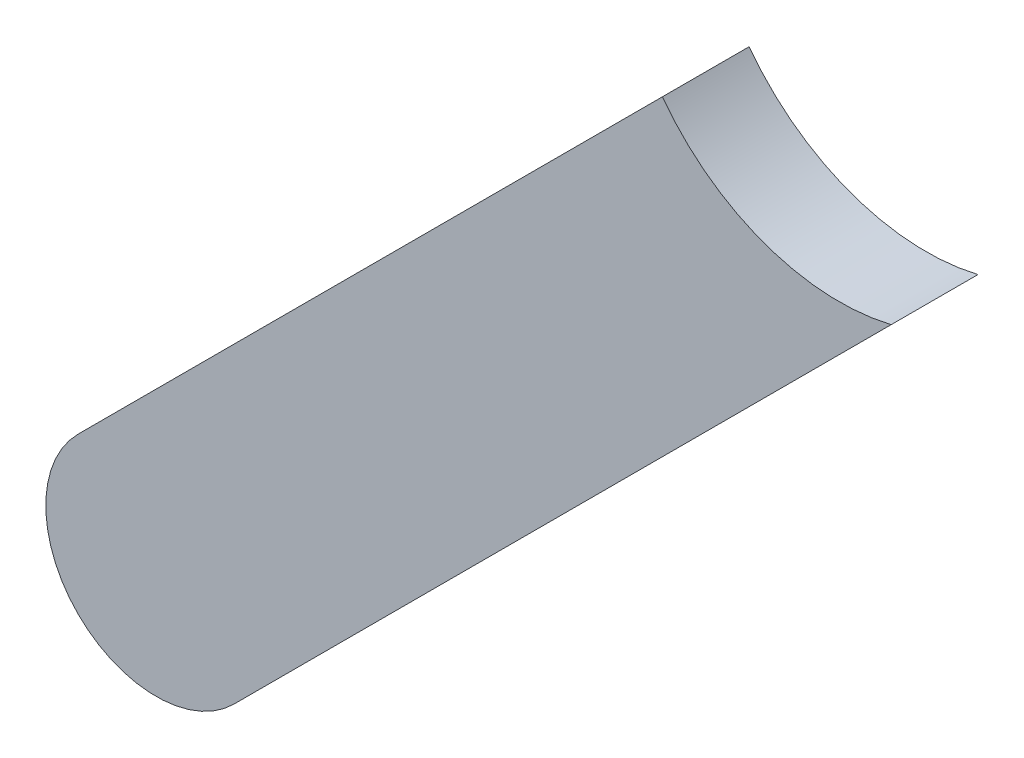
ISO-10303-21;
HEADER;
FILE_DESCRIPTION(('STEP AP214'),'2;1');
FILE_NAME('part.step','',(''),(''),'','','');
FILE_SCHEMA(('AUTOMOTIVE_DESIGN { 1 0 10303 214 1 1 1 1 }'));
ENDSEC;
DATA;
#1=APPLICATION_CONTEXT('core data for automotive mechanical design processes');
#2=APPLICATION_PROTOCOL_DEFINITION('international standard','automotive_design',2000,#1);
#3=PRODUCT_CONTEXT('',#1,'mechanical');
#4=PRODUCT('Part','Part','',(#3));
#5=PRODUCT_RELATED_PRODUCT_CATEGORY('part','',(#4));
#6=PRODUCT_DEFINITION_FORMATION('','',#4);
#7=PRODUCT_DEFINITION_CONTEXT('part definition',#1,'design');
#8=PRODUCT_DEFINITION('design','',#6,#7);
#9=PRODUCT_DEFINITION_SHAPE('','',#8);
#10=(LENGTH_UNIT() NAMED_UNIT(*) SI_UNIT(.MILLI.,.METRE.));
#11=(NAMED_UNIT(*) PLANE_ANGLE_UNIT() SI_UNIT($,.RADIAN.));
#12=(NAMED_UNIT(*) SI_UNIT($,.STERADIAN.) SOLID_ANGLE_UNIT());
#13=UNCERTAINTY_MEASURE_WITH_UNIT(LENGTH_MEASURE(1.E-05),#10,'distance_accuracy_value','');
#14=(GEOMETRIC_REPRESENTATION_CONTEXT(3) GLOBAL_UNCERTAINTY_ASSIGNED_CONTEXT((#13)) GLOBAL_UNIT_ASSIGNED_CONTEXT((#10,
#11,#12)) REPRESENTATION_CONTEXT('',''));
#15=CARTESIAN_POINT('',(0.,0.,0.));
#16=DIRECTION('',(0.,0.,1.));
#17=DIRECTION('',(1.,0.,0.));
#18=AXIS2_PLACEMENT_3D('',#15,#16,#17);
#19=CARTESIAN_POINT('',(151.38580594,113.43459406,0.));
#20=DIRECTION('',(-0.707106781186548,0.707106781186548,0.));
#21=DIRECTION('',(0.707106781186548,0.707106781186548,0.));
#22=AXIS2_PLACEMENT_3D('',#19,#20,#21);
#23=PLANE('',#22);
#24=DIRECTION('',(0.707106781186548,0.707106781186548,0.));
#25=VECTOR('',#24,1.);
#26=CARTESIAN_POINT('',(151.38580594,113.43459406,0.1999996));
#27=LINE('',#26,#25);
#28=CARTESIAN_POINT('',(151.38580594,113.43459406,0.1999996));
#29=VERTEX_POINT('',#28);
#30=CARTESIAN_POINT('',(152.900456808138,114.949244928138,0.1999996));
#31=VERTEX_POINT('',#30);
#32=EDGE_CURVE('E11',#29,#31,#27,.T.);
#33=ORIENTED_EDGE('',*,*,#32,.F.);
#34=DIRECTION('',(0.,0.,1.));
#35=VECTOR('',#34,1.);
#36=CARTESIAN_POINT('',(151.38580594,113.43459406,0.));
#37=LINE('',#36,#35);
#38=CARTESIAN_POINT('',(151.38580594,113.43459406,0.));
#39=VERTEX_POINT('',#38);
#40=EDGE_CURVE('E24',#39,#29,#37,.T.);
#41=ORIENTED_EDGE('',*,*,#40,.F.);
#42=DIRECTION('',(0.707106781186548,0.707106781186548,0.));
#43=VECTOR('',#42,1.);
#44=CARTESIAN_POINT('',(151.38580594,113.43459406,0.));
#45=LINE('',#44,#43);
#46=CARTESIAN_POINT('',(152.900456808138,114.949244928138,0.));
#47=VERTEX_POINT('',#46);
#48=EDGE_CURVE('E75',#39,#47,#45,.T.);
#49=ORIENTED_EDGE('',*,*,#48,.T.);
#50=DIRECTION('',(0.,0.,1.));
#51=VECTOR('',#50,1.);
#52=CARTESIAN_POINT('',(152.900456808138,114.949244928138,0.));
#53=LINE('',#52,#51);
#54=EDGE_CURVE('E37',#47,#31,#53,.T.);
#55=ORIENTED_EDGE('',*,*,#54,.T.);
#56=EDGE_LOOP('',(#33,#41,#49,#55));
#57=FACE_BOUND('',#56,.T.);
#58=ADVANCED_FACE('F17',(#57),#23,.F.);
#59=CARTESIAN_POINT('',(152.781,115.443,0.));
#60=DIRECTION('',(0.,0.,-1.));
#61=DIRECTION('',(1.,0.,0.));
#62=AXIS2_PLACEMENT_3D('',#59,#60,#61);
#63=CYLINDRICAL_SURFACE('',#62,0.508);
#64=DIRECTION('',(0.,0.,1.));
#65=VECTOR('',#64,1.);
#66=CARTESIAN_POINT('',(152.373056734242,115.140268614242,0.));
#67=LINE('',#66,#65);
#68=CARTESIAN_POINT('',(152.373056734242,115.140268614242,0.));
#69=VERTEX_POINT('',#68);
#70=CARTESIAN_POINT('',(152.373056734242,115.140268614242,0.1999996));
#71=VERTEX_POINT('',#70);
#72=EDGE_CURVE('E67',#69,#71,#67,.T.);
#73=ORIENTED_EDGE('',*,*,#72,.T.);
#74=CARTESIAN_POINT('',(152.781,115.443,0.1999996));
#75=DIRECTION('',(0.,0.,1.));
#76=DIRECTION('',(1.,0.,0.));
#77=AXIS2_PLACEMENT_3D('',#74,#75,#76);
#78=CIRCLE('',#77,0.508);
#79=EDGE_CURVE('E82',#71,#31,#78,.T.);
#80=ORIENTED_EDGE('',*,*,#79,.T.);
#81=ORIENTED_EDGE('',*,*,#54,.F.);
#82=CARTESIAN_POINT('',(152.781,115.443,0.));
#83=DIRECTION('',(0.,0.,1.));
#84=DIRECTION('',(1.,0.,0.));
#85=AXIS2_PLACEMENT_3D('',#82,#83,#84);
#86=CIRCLE('',#85,0.508);
#87=EDGE_CURVE('E80',#69,#47,#86,.T.);
#88=ORIENTED_EDGE('',*,*,#87,.F.);
#89=EDGE_LOOP('',(#73,#80,#81,#88));
#90=FACE_BOUND('',#89,.T.);
#91=ADVANCED_FACE('F88',(#90),#63,.F.);
#92=CARTESIAN_POINT('',(152.373056734242,115.140268614242,0.));
#93=DIRECTION('',(0.707106781186548,-0.707106781186548,0.));
#94=DIRECTION('',(-0.707106781186548,-0.707106781186548,0.));
#95=AXIS2_PLACEMENT_3D('',#92,#93,#94);
#96=PLANE('',#95);
#97=DIRECTION('',(-0.707106781186548,-0.707106781186548,0.));
#98=VECTOR('',#97,1.);
#99=CARTESIAN_POINT('',(152.60139406,115.36860594,0.1999996));
#100=LINE('',#99,#98);
#101=CARTESIAN_POINT('',(151.02659406,113.79380594,0.1999996));
#102=VERTEX_POINT('',#101);
#103=EDGE_CURVE('E71',#71,#102,#100,.T.);
#104=ORIENTED_EDGE('',*,*,#103,.F.);
#105=ORIENTED_EDGE('',*,*,#72,.F.);
#106=DIRECTION('',(-0.707106781186548,-0.707106781186548,0.));
#107=VECTOR('',#106,1.);
#108=CARTESIAN_POINT('',(152.60139406,115.36860594,0.));
#109=LINE('',#108,#107);
#110=CARTESIAN_POINT('',(151.02659406,113.79380594,0.));
#111=VERTEX_POINT('',#110);
#112=EDGE_CURVE('E63',#69,#111,#109,.T.);
#113=ORIENTED_EDGE('',*,*,#112,.T.);
#114=DIRECTION('',(0.,0.,1.));
#115=VECTOR('',#114,1.);
#116=CARTESIAN_POINT('',(151.02659406,113.79380594,0.));
#117=LINE('',#116,#115);
#118=EDGE_CURVE('E53',#111,#102,#117,.T.);
#119=ORIENTED_EDGE('',*,*,#118,.T.);
#120=EDGE_LOOP('',(#104,#105,#113,#119));
#121=FACE_BOUND('',#120,.T.);
#122=ADVANCED_FACE('F66',(#121),#96,.F.);
#123=CARTESIAN_POINT('',(151.2062,113.6142,0.));
#124=DIRECTION('',(0.,0.,-1.));
#125=DIRECTION('',(-0.70710678118652,0.707106781186576,0.));
#126=AXIS2_PLACEMENT_3D('',#123,#124,#125);
#127=CYLINDRICAL_SURFACE('',#126,0.254001156230768);
#128=CARTESIAN_POINT('',(151.2062,113.6142,0.1999996));
#129=DIRECTION('',(0.,0.,1.));
#130=DIRECTION('',(-0.70710678118652,0.707106781186576,0.));
#131=AXIS2_PLACEMENT_3D('',#128,#129,#130);
#132=CIRCLE('',#131,0.254001156230768);
#133=EDGE_CURVE('E59',#102,#29,#132,.T.);
#134=ORIENTED_EDGE('',*,*,#133,.F.);
#135=ORIENTED_EDGE('',*,*,#118,.F.);
#136=CARTESIAN_POINT('',(151.2062,113.6142,0.));
#137=DIRECTION('',(0.,0.,1.));
#138=DIRECTION('',(-0.70710678118652,0.707106781186576,0.));
#139=AXIS2_PLACEMENT_3D('',#136,#137,#138);
#140=CIRCLE('',#139,0.254001156230768);
#141=EDGE_CURVE('E57',#111,#39,#140,.T.);
#142=ORIENTED_EDGE('',*,*,#141,.T.);
#143=ORIENTED_EDGE('',*,*,#40,.T.);
#144=EDGE_LOOP('',(#134,#135,#142,#143));
#145=FACE_BOUND('',#144,.T.);
#146=ADVANCED_FACE('F55',(#145),#127,.T.);
#147=CARTESIAN_POINT('',(151.38580594,113.43459406,0.));
#148=DIRECTION('',(0.,0.,-1.));
#149=DIRECTION('',(-1.,0.,0.));
#150=AXIS2_PLACEMENT_3D('',#147,#148,#149);
#151=PLANE('',#150);
#152=ORIENTED_EDGE('',*,*,#48,.F.);
#153=ORIENTED_EDGE('',*,*,#141,.F.);
#154=ORIENTED_EDGE('',*,*,#112,.F.);
#155=ORIENTED_EDGE('',*,*,#87,.T.);
#156=EDGE_LOOP('',(#152,#153,#154,#155));
#157=FACE_BOUND('',#156,.T.);
#158=ADVANCED_FACE('F74',(#157),#151,.T.);
#159=CARTESIAN_POINT('',(151.38580594,113.43459406,0.1999996));
#160=DIRECTION('',(0.,0.,-1.));
#161=DIRECTION('',(-1.,0.,0.));
#162=AXIS2_PLACEMENT_3D('',#159,#160,#161);
#163=PLANE('',#162);
#164=ORIENTED_EDGE('',*,*,#133,.T.);
#165=ORIENTED_EDGE('',*,*,#32,.T.);
#166=ORIENTED_EDGE('',*,*,#79,.F.);
#167=ORIENTED_EDGE('',*,*,#103,.T.);
#168=EDGE_LOOP('',(#164,#165,#166,#167));
#169=FACE_BOUND('',#168,.T.);
#170=ADVANCED_FACE('F91',(#169),#163,.F.);
#171=CLOSED_SHELL('',(#58,#91,#122,#146,#158,#170));
#172=MANIFOLD_SOLID_BREP('B1',#171);
#173=ADVANCED_BREP_SHAPE_REPRESENTATION('',(#18,#172),#14);
#174=SHAPE_DEFINITION_REPRESENTATION(#9,#173);
ENDSEC;
END-ISO-10303-21;
